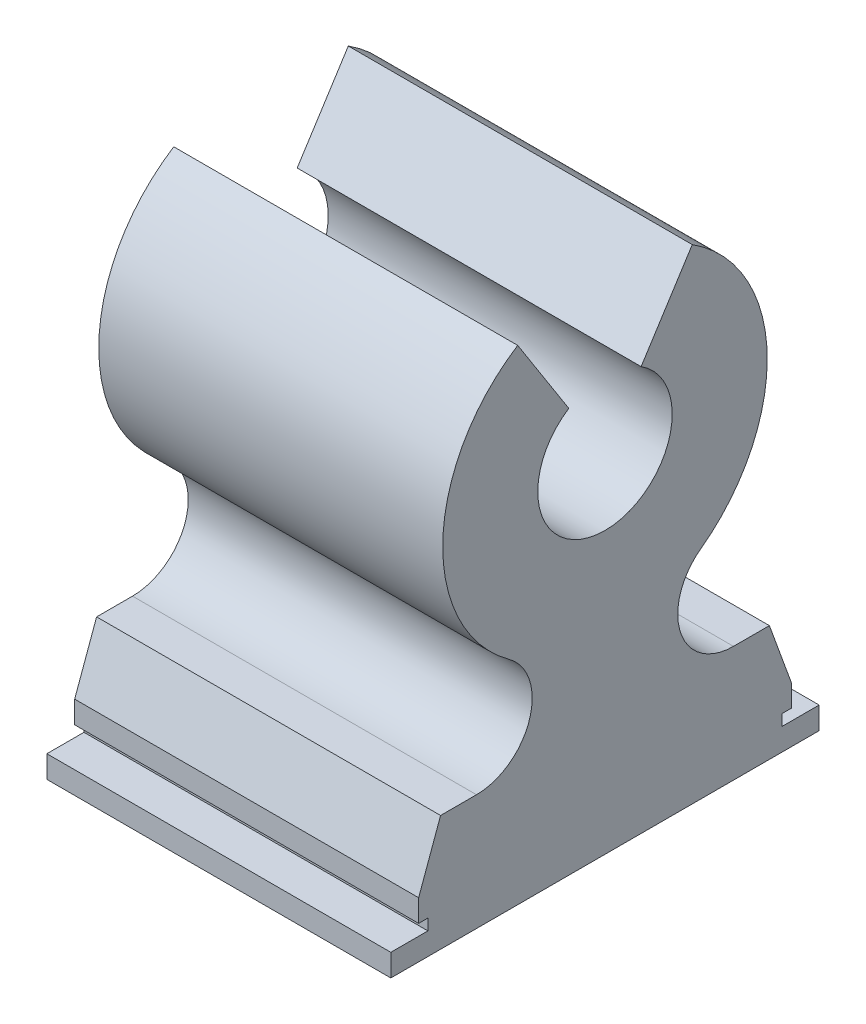
ISO-10303-21;
HEADER;
FILE_DESCRIPTION(('STEP AP214'),'2;1');
FILE_NAME('part.step','',(''),(''),'','','');
FILE_SCHEMA(('AUTOMOTIVE_DESIGN { 1 0 10303 214 1 1 1 1 }'));
ENDSEC;
DATA;
#1=APPLICATION_CONTEXT('core data for automotive mechanical design processes');
#2=APPLICATION_PROTOCOL_DEFINITION('international standard','automotive_design',2000,#1);
#3=PRODUCT_CONTEXT('',#1,'mechanical');
#4=PRODUCT('Part','Part','',(#3));
#5=PRODUCT_RELATED_PRODUCT_CATEGORY('part','',(#4));
#6=PRODUCT_DEFINITION_FORMATION('','',#4);
#7=PRODUCT_DEFINITION_CONTEXT('part definition',#1,'design');
#8=PRODUCT_DEFINITION('design','',#6,#7);
#9=PRODUCT_DEFINITION_SHAPE('','',#8);
#10=(LENGTH_UNIT() NAMED_UNIT(*) SI_UNIT(.MILLI.,.METRE.));
#11=(NAMED_UNIT(*) PLANE_ANGLE_UNIT() SI_UNIT($,.RADIAN.));
#12=(NAMED_UNIT(*) SI_UNIT($,.STERADIAN.) SOLID_ANGLE_UNIT());
#13=UNCERTAINTY_MEASURE_WITH_UNIT(LENGTH_MEASURE(1.E-05),#10,'distance_accuracy_value','');
#14=(GEOMETRIC_REPRESENTATION_CONTEXT(3) GLOBAL_UNCERTAINTY_ASSIGNED_CONTEXT((#13)) GLOBAL_UNIT_ASSIGNED_CONTEXT((#10,
#11,#12)) REPRESENTATION_CONTEXT('',''));
#15=CARTESIAN_POINT('',(0.,0.,0.));
#16=DIRECTION('',(0.,0.,1.));
#17=DIRECTION('',(1.,0.,0.));
#18=AXIS2_PLACEMENT_3D('',#15,#16,#17);
#19=CARTESIAN_POINT('',(9.4234,-9.525,5.8674));
#20=DIRECTION('',(0.,0.,-1.));
#21=DIRECTION('',(0.,1.,0.));
#22=AXIS2_PLACEMENT_3D('',#19,#20,#21);
#23=PLANE('',#22);
#24=DIRECTION('',(0.,-1.,0.));
#25=VECTOR('',#24,1.);
#26=CARTESIAN_POINT('',(0.,-9.525,5.8674));
#27=LINE('',#26,#25);
#28=CARTESIAN_POINT('',(0.,-8.9154,5.8674));
#29=VERTEX_POINT('',#28);
#30=CARTESIAN_POINT('',(0.,-9.525,5.8674));
#31=VERTEX_POINT('',#30);
#32=EDGE_CURVE('E212',#29,#31,#27,.T.);
#33=ORIENTED_EDGE('',*,*,#32,.T.);
#34=DIRECTION('',(-1.,0.,0.));
#35=VECTOR('',#34,1.);
#36=CARTESIAN_POINT('',(9.4234,-9.525,5.8674));
#37=LINE('',#36,#35);
#38=CARTESIAN_POINT('',(9.4234,-9.525,5.8674));
#39=VERTEX_POINT('',#38);
#40=EDGE_CURVE('E11',#39,#31,#37,.T.);
#41=ORIENTED_EDGE('',*,*,#40,.F.);
#42=DIRECTION('',(0.,-1.,0.));
#43=VECTOR('',#42,1.);
#44=CARTESIAN_POINT('',(9.4234,-9.525,5.8674));
#45=LINE('',#44,#43);
#46=CARTESIAN_POINT('',(9.4234,-8.9154,5.8674));
#47=VERTEX_POINT('',#46);
#48=EDGE_CURVE('E254',#47,#39,#45,.T.);
#49=ORIENTED_EDGE('',*,*,#48,.F.);
#50=DIRECTION('',(-1.,0.,0.));
#51=VECTOR('',#50,1.);
#52=CARTESIAN_POINT('',(9.4234,-8.9154,5.8674));
#53=LINE('',#52,#51);
#54=EDGE_CURVE('E208',#47,#29,#53,.T.);
#55=ORIENTED_EDGE('',*,*,#54,.T.);
#56=EDGE_LOOP('',(#33,#41,#49,#55));
#57=FACE_BOUND('',#56,.T.);
#58=ADVANCED_FACE('F32',(#57),#23,.F.);
#59=CARTESIAN_POINT('',(9.4234,-9.525,5.8674));
#60=DIRECTION('',(0.,1.,0.));
#61=DIRECTION('',(0.,0.,1.));
#62=AXIS2_PLACEMENT_3D('',#59,#60,#61);
#63=PLANE('',#62);
#64=DIRECTION('',(0.,0.,-1.));
#65=VECTOR('',#64,1.);
#66=CARTESIAN_POINT('',(0.,-9.525,5.8674));
#67=LINE('',#66,#65);
#68=CARTESIAN_POINT('',(0.,-9.525,-5.8674));
#69=VERTEX_POINT('',#68);
#70=EDGE_CURVE('E215',#31,#69,#67,.T.);
#71=ORIENTED_EDGE('',*,*,#70,.T.);
#72=DIRECTION('',(-1.,0.,0.));
#73=VECTOR('',#72,1.);
#74=CARTESIAN_POINT('',(9.4234,-9.525,-5.8674));
#75=LINE('',#74,#73);
#76=CARTESIAN_POINT('',(9.4234,-9.525,-5.8674));
#77=VERTEX_POINT('',#76);
#78=EDGE_CURVE('E40',#77,#69,#75,.T.);
#79=ORIENTED_EDGE('',*,*,#78,.F.);
#80=DIRECTION('',(0.,0.,-1.));
#81=VECTOR('',#80,1.);
#82=CARTESIAN_POINT('',(9.4234,-9.525,5.8674));
#83=LINE('',#82,#81);
#84=EDGE_CURVE('E133',#39,#77,#83,.T.);
#85=ORIENTED_EDGE('',*,*,#84,.F.);
#86=ORIENTED_EDGE('',*,*,#40,.T.);
#87=EDGE_LOOP('',(#71,#79,#85,#86));
#88=FACE_BOUND('',#87,.T.);
#89=ADVANCED_FACE('F382',(#88),#63,.F.);
#90=CARTESIAN_POINT('',(9.4234,-9.525,-5.8674));
#91=DIRECTION('',(0.,0.,1.));
#92=DIRECTION('',(0.,-1.,0.));
#93=AXIS2_PLACEMENT_3D('',#90,#91,#92);
#94=PLANE('',#93);
#95=DIRECTION('',(0.,1.,0.));
#96=VECTOR('',#95,1.);
#97=CARTESIAN_POINT('',(0.,-9.525,-5.8674));
#98=LINE('',#97,#96);
#99=CARTESIAN_POINT('',(0.,-8.9154,-5.8674));
#100=VERTEX_POINT('',#99);
#101=EDGE_CURVE('E217',#69,#100,#98,.T.);
#102=ORIENTED_EDGE('',*,*,#101,.T.);
#103=DIRECTION('',(-1.,0.,0.));
#104=VECTOR('',#103,1.);
#105=CARTESIAN_POINT('',(9.4234,-8.9154,-5.8674));
#106=LINE('',#105,#104);
#107=CARTESIAN_POINT('',(9.4234,-8.9154,-5.8674));
#108=VERTEX_POINT('',#107);
#109=EDGE_CURVE('E303',#108,#100,#106,.T.);
#110=ORIENTED_EDGE('',*,*,#109,.F.);
#111=DIRECTION('',(0.,1.,0.));
#112=VECTOR('',#111,1.);
#113=CARTESIAN_POINT('',(9.4234,-9.525,-5.8674));
#114=LINE('',#113,#112);
#115=EDGE_CURVE('E311',#77,#108,#114,.T.);
#116=ORIENTED_EDGE('',*,*,#115,.F.);
#117=ORIENTED_EDGE('',*,*,#78,.T.);
#118=EDGE_LOOP('',(#102,#110,#116,#117));
#119=FACE_BOUND('',#118,.T.);
#120=ADVANCED_FACE('F309',(#119),#94,.F.);
#121=CARTESIAN_POINT('',(9.4234,-8.9154,-5.8674));
#122=DIRECTION('',(0.,-1.,0.));
#123=DIRECTION('',(0.,0.,-1.));
#124=AXIS2_PLACEMENT_3D('',#121,#122,#123);
#125=PLANE('',#124);
#126=DIRECTION('',(0.,0.,1.));
#127=VECTOR('',#126,1.);
#128=CARTESIAN_POINT('',(0.,-8.9154,-5.8674));
#129=LINE('',#128,#127);
#130=CARTESIAN_POINT('',(0.,-8.9154,-4.8514));
#131=VERTEX_POINT('',#130);
#132=EDGE_CURVE('E219',#100,#131,#129,.T.);
#133=ORIENTED_EDGE('',*,*,#132,.T.);
#134=DIRECTION('',(-1.,0.,0.));
#135=VECTOR('',#134,1.);
#136=CARTESIAN_POINT('',(9.4234,-8.9154,-4.8514));
#137=LINE('',#136,#135);
#138=CARTESIAN_POINT('',(9.4234,-8.9154,-4.8514));
#139=VERTEX_POINT('',#138);
#140=EDGE_CURVE('E300',#139,#131,#137,.T.);
#141=ORIENTED_EDGE('',*,*,#140,.F.);
#142=DIRECTION('',(0.,0.,1.));
#143=VECTOR('',#142,1.);
#144=CARTESIAN_POINT('',(9.4234,-8.9154,-5.8674));
#145=LINE('',#144,#143);
#146=EDGE_CURVE('E329',#108,#139,#145,.T.);
#147=ORIENTED_EDGE('',*,*,#146,.F.);
#148=ORIENTED_EDGE('',*,*,#109,.T.);
#149=EDGE_LOOP('',(#133,#141,#147,#148));
#150=FACE_BOUND('',#149,.T.);
#151=ADVANCED_FACE('F320',(#150),#125,.F.);
#152=CARTESIAN_POINT('',(9.4234,-8.9154,-4.8514));
#153=DIRECTION('',(0.,0.,1.));
#154=DIRECTION('',(0.,-1.,0.));
#155=AXIS2_PLACEMENT_3D('',#152,#153,#154);
#156=PLANE('',#155);
#157=DIRECTION('',(0.,1.,0.));
#158=VECTOR('',#157,1.);
#159=CARTESIAN_POINT('',(0.,-8.9154,-4.8514));
#160=LINE('',#159,#158);
#161=CARTESIAN_POINT('',(0.,-8.6106,-4.8514));
#162=VERTEX_POINT('',#161);
#163=EDGE_CURVE('E221',#131,#162,#160,.T.);
#164=ORIENTED_EDGE('',*,*,#163,.T.);
#165=DIRECTION('',(-1.,0.,0.));
#166=VECTOR('',#165,1.);
#167=CARTESIAN_POINT('',(9.4234,-8.6106,-4.8514));
#168=LINE('',#167,#166);
#169=CARTESIAN_POINT('',(9.4234,-8.6106,-4.8514));
#170=VERTEX_POINT('',#169);
#171=EDGE_CURVE('E297',#170,#162,#168,.T.);
#172=ORIENTED_EDGE('',*,*,#171,.F.);
#173=DIRECTION('',(0.,1.,0.));
#174=VECTOR('',#173,1.);
#175=CARTESIAN_POINT('',(9.4234,-8.9154,-4.8514));
#176=LINE('',#175,#174);
#177=EDGE_CURVE('E326',#139,#170,#176,.T.);
#178=ORIENTED_EDGE('',*,*,#177,.F.);
#179=ORIENTED_EDGE('',*,*,#140,.T.);
#180=EDGE_LOOP('',(#164,#172,#178,#179));
#181=FACE_BOUND('',#180,.T.);
#182=ADVANCED_FACE('F324',(#181),#156,.F.);
#183=CARTESIAN_POINT('',(9.4234,-8.6106,-4.8514));
#184=DIRECTION('',(0.,1.,0.));
#185=DIRECTION('',(0.,0.,1.));
#186=AXIS2_PLACEMENT_3D('',#183,#184,#185);
#187=PLANE('',#186);
#188=DIRECTION('',(0.,0.,-1.));
#189=VECTOR('',#188,1.);
#190=CARTESIAN_POINT('',(0.,-8.6106,-4.8514));
#191=LINE('',#190,#189);
#192=CARTESIAN_POINT('',(0.,-8.6106,-5.1054));
#193=VERTEX_POINT('',#192);
#194=EDGE_CURVE('E223',#162,#193,#191,.T.);
#195=ORIENTED_EDGE('',*,*,#194,.T.);
#196=DIRECTION('',(-1.,0.,0.));
#197=VECTOR('',#196,1.);
#198=CARTESIAN_POINT('',(9.4234,-8.6106,-5.1054));
#199=LINE('',#198,#197);
#200=CARTESIAN_POINT('',(9.4234,-8.6106,-5.1054));
#201=VERTEX_POINT('',#200);
#202=EDGE_CURVE('E294',#201,#193,#199,.T.);
#203=ORIENTED_EDGE('',*,*,#202,.F.);
#204=DIRECTION('',(0.,0.,-1.));
#205=VECTOR('',#204,1.);
#206=CARTESIAN_POINT('',(9.4234,-8.6106,-4.8514));
#207=LINE('',#206,#205);
#208=EDGE_CURVE('E328',#170,#201,#207,.T.);
#209=ORIENTED_EDGE('',*,*,#208,.F.);
#210=ORIENTED_EDGE('',*,*,#171,.T.);
#211=EDGE_LOOP('',(#195,#203,#209,#210));
#212=FACE_BOUND('',#211,.T.);
#213=ADVANCED_FACE('F395',(#212),#187,.F.);
#214=CARTESIAN_POINT('',(9.4234,-8.001,-5.1054));
#215=DIRECTION('',(0.,0.,1.));
#216=DIRECTION('',(0.,-1.,0.));
#217=AXIS2_PLACEMENT_3D('',#214,#215,#216);
#218=PLANE('',#217);
#219=DIRECTION('',(0.,1.,0.));
#220=VECTOR('',#219,1.);
#221=CARTESIAN_POINT('',(0.,-8.001,-5.1054));
#222=LINE('',#221,#220);
#223=CARTESIAN_POINT('',(0.,-8.001,-5.1054));
#224=VERTEX_POINT('',#223);
#225=EDGE_CURVE('E225',#193,#224,#222,.T.);
#226=ORIENTED_EDGE('',*,*,#225,.T.);
#227=DIRECTION('',(-1.,0.,0.));
#228=VECTOR('',#227,1.);
#229=CARTESIAN_POINT('',(9.4234,-8.001,-5.1054));
#230=LINE('',#229,#228);
#231=CARTESIAN_POINT('',(9.4234,-8.001,-5.1054));
#232=VERTEX_POINT('',#231);
#233=EDGE_CURVE('E291',#232,#224,#230,.T.);
#234=ORIENTED_EDGE('',*,*,#233,.F.);
#235=DIRECTION('',(0.,1.,0.));
#236=VECTOR('',#235,1.);
#237=CARTESIAN_POINT('',(9.4234,-8.001,-5.1054));
#238=LINE('',#237,#236);
#239=EDGE_CURVE('E331',#201,#232,#238,.T.);
#240=ORIENTED_EDGE('',*,*,#239,.F.);
#241=ORIENTED_EDGE('',*,*,#202,.T.);
#242=EDGE_LOOP('',(#226,#234,#240,#241));
#243=FACE_BOUND('',#242,.T.);
#244=ADVANCED_FACE('F398',(#243),#218,.F.);
#245=CARTESIAN_POINT('',(9.4234,-6.35,-4.5044851432265));
#246=DIRECTION('',(0.,-0.34202014332567,0.939692620785908));
#247=DIRECTION('',(0.,-0.939692620785908,-0.34202014332567));
#248=AXIS2_PLACEMENT_3D('',#245,#246,#247);
#249=PLANE('',#248);
#250=DIRECTION('',(0.,0.939692620785908,0.34202014332567));
#251=VECTOR('',#250,1.);
#252=CARTESIAN_POINT('',(0.,-6.35,-4.5044851432265));
#253=LINE('',#252,#251);
#254=CARTESIAN_POINT('',(0.,-6.35,-4.5044851432265));
#255=VERTEX_POINT('',#254);
#256=EDGE_CURVE('E227',#224,#255,#253,.T.);
#257=ORIENTED_EDGE('',*,*,#256,.T.);
#258=DIRECTION('',(-1.,0.,0.));
#259=VECTOR('',#258,1.);
#260=CARTESIAN_POINT('',(9.4234,-6.35,-4.5044851432265));
#261=LINE('',#260,#259);
#262=CARTESIAN_POINT('',(9.4234,-6.35,-4.5044851432265));
#263=VERTEX_POINT('',#262);
#264=EDGE_CURVE('E288',#263,#255,#261,.T.);
#265=ORIENTED_EDGE('',*,*,#264,.F.);
#266=DIRECTION('',(0.,0.939692620785908,0.34202014332567));
#267=VECTOR('',#266,1.);
#268=CARTESIAN_POINT('',(9.4234,-6.35,-4.5044851432265));
#269=LINE('',#268,#267);
#270=EDGE_CURVE('E337',#232,#263,#269,.T.);
#271=ORIENTED_EDGE('',*,*,#270,.F.);
#272=ORIENTED_EDGE('',*,*,#233,.T.);
#273=EDGE_LOOP('',(#257,#265,#271,#272));
#274=FACE_BOUND('',#273,.T.);
#275=ADVANCED_FACE('F402',(#274),#249,.F.);
#276=CARTESIAN_POINT('',(9.4234,-6.35,-4.5044851432265));
#277=DIRECTION('',(0.,-1.,0.));
#278=DIRECTION('',(0.,0.,-1.));
#279=AXIS2_PLACEMENT_3D('',#276,#277,#278);
#280=PLANE('',#279);
#281=DIRECTION('',(0.,0.,1.));
#282=VECTOR('',#281,1.);
#283=CARTESIAN_POINT('',(0.,-6.35,-4.5044851432265));
#284=LINE('',#283,#282);
#285=CARTESIAN_POINT('',(0.,-6.35,-3.5204382262572));
#286=VERTEX_POINT('',#285);
#287=EDGE_CURVE('E229',#255,#286,#284,.T.);
#288=ORIENTED_EDGE('',*,*,#287,.T.);
#289=DIRECTION('',(-1.,0.,0.));
#290=VECTOR('',#289,1.);
#291=CARTESIAN_POINT('',(9.4234,-6.35,-3.5204382262572));
#292=LINE('',#291,#290);
#293=CARTESIAN_POINT('',(9.4234,-6.35,-3.5204382262572));
#294=VERTEX_POINT('',#293);
#295=EDGE_CURVE('E285',#294,#286,#292,.T.);
#296=ORIENTED_EDGE('',*,*,#295,.F.);
#297=DIRECTION('',(0.,0.,1.));
#298=VECTOR('',#297,1.);
#299=CARTESIAN_POINT('',(9.4234,-6.35,-4.5044851432265));
#300=LINE('',#299,#298);
#301=EDGE_CURVE('E339',#263,#294,#300,.T.);
#302=ORIENTED_EDGE('',*,*,#301,.F.);
#303=ORIENTED_EDGE('',*,*,#264,.T.);
#304=EDGE_LOOP('',(#288,#296,#302,#303));
#305=FACE_BOUND('',#304,.T.);
#306=ADVANCED_FACE('F406',(#305),#280,.F.);
#307=CARTESIAN_POINT('',(9.4234,-4.8234617737428,-3.5204382262572));
#308=DIRECTION('',(-1.,0.,0.));
#309=DIRECTION('',(0.,0.,1.));
#310=AXIS2_PLACEMENT_3D('',#307,#308,#309);
#311=CYLINDRICAL_SURFACE('',#310,1.5265382262572);
#312=CARTESIAN_POINT('',(0.,-4.8234617737428,-3.5204382262572));
#313=DIRECTION('',(-1.,0.,0.));
#314=DIRECTION('',(0.,0.,1.));
#315=AXIS2_PLACEMENT_3D('',#312,#313,#314);
#316=CIRCLE('',#315,1.5265382262572);
#317=CARTESIAN_POINT('',(0.,-3.59041285041307,-2.62048861161209));
#318=VERTEX_POINT('',#317);
#319=EDGE_CURVE('E231',#286,#318,#316,.T.);
#320=ORIENTED_EDGE('',*,*,#319,.T.);
#321=DIRECTION('',(-1.,0.,0.));
#322=VECTOR('',#321,1.);
#323=CARTESIAN_POINT('',(9.4234,-3.59041285041307,-2.62048861161209));
#324=LINE('',#323,#322);
#325=CARTESIAN_POINT('',(9.4234,-3.59041285041307,-2.62048861161209));
#326=VERTEX_POINT('',#325);
#327=EDGE_CURVE('E282',#326,#318,#324,.T.);
#328=ORIENTED_EDGE('',*,*,#327,.F.);
#329=CARTESIAN_POINT('',(9.4234,-4.8234617737428,-3.5204382262572));
#330=DIRECTION('',(-1.,0.,0.));
#331=DIRECTION('',(0.,0.,1.));
#332=AXIS2_PLACEMENT_3D('',#329,#330,#331);
#333=CIRCLE('',#332,1.5265382262572);
#334=EDGE_CURVE('E341',#294,#326,#333,.T.);
#335=ORIENTED_EDGE('',*,*,#334,.F.);
#336=ORIENTED_EDGE('',*,*,#295,.T.);
#337=EDGE_LOOP('',(#320,#328,#335,#336));
#338=FACE_BOUND('',#337,.T.);
#339=ADVANCED_FACE('F410',(#338),#311,.F.);
#340=CARTESIAN_POINT('',(9.4234,0.,0.));
#341=DIRECTION('',(-1.,0.,0.));
#342=DIRECTION('',(0.,0.,1.));
#343=AXIS2_PLACEMENT_3D('',#340,#341,#342);
#344=CYLINDRICAL_SURFACE('',#343,4.445);
#345=CARTESIAN_POINT('',(0.,0.,0.));
#346=DIRECTION('',(1.,0.,0.));
#347=DIRECTION('',(0.,0.,-1.));
#348=AXIS2_PLACEMENT_3D('',#345,#346,#347);
#349=CIRCLE('',#348,4.445);
#350=CARTESIAN_POINT('',(0.,3.74708544066496,-2.39110344827586));
#351=VERTEX_POINT('',#350);
#352=EDGE_CURVE('E233',#318,#351,#349,.T.);
#353=ORIENTED_EDGE('',*,*,#352,.T.);
#354=DIRECTION('',(-1.,0.,0.));
#355=VECTOR('',#354,1.);
#356=CARTESIAN_POINT('',(9.4234,3.74708544066496,-2.39110344827586));
#357=LINE('',#356,#355);
#358=CARTESIAN_POINT('',(9.4234,3.74708544066496,-2.39110344827586));
#359=VERTEX_POINT('',#358);
#360=EDGE_CURVE('E279',#359,#351,#357,.T.);
#361=ORIENTED_EDGE('',*,*,#360,.F.);
#362=CARTESIAN_POINT('',(9.4234,0.,0.));
#363=DIRECTION('',(1.,0.,0.));
#364=DIRECTION('',(0.,0.,-1.));
#365=AXIS2_PLACEMENT_3D('',#362,#363,#364);
#366=CIRCLE('',#365,4.445);
#367=EDGE_CURVE('E343',#326,#359,#366,.T.);
#368=ORIENTED_EDGE('',*,*,#367,.F.);
#369=ORIENTED_EDGE('',*,*,#327,.T.);
#370=EDGE_LOOP('',(#353,#361,#368,#369));
#371=FACE_BOUND('',#370,.T.);
#372=ADVANCED_FACE('F414',(#371),#344,.T.);
#373=CARTESIAN_POINT('',(9.4234,1.55236396827548,-0.9906));
#374=DIRECTION('',(0.,-0.537931034482758,-0.842988850543297));
#375=DIRECTION('',(0.,0.842988850543297,-0.537931034482758));
#376=AXIS2_PLACEMENT_3D('',#373,#374,#375);
#377=PLANE('',#376);
#378=DIRECTION('',(0.,-0.842988850543297,0.537931034482758));
#379=VECTOR('',#378,1.);
#380=CARTESIAN_POINT('',(0.,1.55236396827548,-0.9906));
#381=LINE('',#380,#379);
#382=CARTESIAN_POINT('',(0.,1.55236396827548,-0.9906));
#383=VERTEX_POINT('',#382);
#384=EDGE_CURVE('E235',#351,#383,#381,.T.);
#385=ORIENTED_EDGE('',*,*,#384,.T.);
#386=DIRECTION('',(-1.,0.,0.));
#387=VECTOR('',#386,1.);
#388=CARTESIAN_POINT('',(9.4234,1.55236396827548,-0.9906));
#389=LINE('',#388,#387);
#390=CARTESIAN_POINT('',(9.4234,1.55236396827548,-0.9906));
#391=VERTEX_POINT('',#390);
#392=EDGE_CURVE('E276',#391,#383,#389,.T.);
#393=ORIENTED_EDGE('',*,*,#392,.F.);
#394=DIRECTION('',(0.,-0.842988850543297,0.537931034482758));
#395=VECTOR('',#394,1.);
#396=CARTESIAN_POINT('',(9.4234,1.55236396827548,-0.9906));
#397=LINE('',#396,#395);
#398=EDGE_CURVE('E345',#359,#391,#397,.T.);
#399=ORIENTED_EDGE('',*,*,#398,.F.);
#400=ORIENTED_EDGE('',*,*,#360,.T.);
#401=EDGE_LOOP('',(#385,#393,#399,#400));
#402=FACE_BOUND('',#401,.T.);
#403=ADVANCED_FACE('F418',(#402),#377,.F.);
#404=CARTESIAN_POINT('',(9.4234,0.,0.));
#405=DIRECTION('',(-1.,0.,0.));
#406=DIRECTION('',(0.,0.,1.));
#407=AXIS2_PLACEMENT_3D('',#404,#405,#406);
#408=CYLINDRICAL_SURFACE('',#407,1.8415);
#409=CARTESIAN_POINT('',(0.,0.,0.));
#410=DIRECTION('',(-1.,0.,0.));
#411=DIRECTION('',(0.,0.,-1.));
#412=AXIS2_PLACEMENT_3D('',#409,#410,#411);
#413=CIRCLE('',#412,1.8415);
#414=CARTESIAN_POINT('',(0.,1.55236396827548,0.990599999999999));
#415=VERTEX_POINT('',#414);
#416=EDGE_CURVE('E237',#383,#415,#413,.T.);
#417=ORIENTED_EDGE('',*,*,#416,.T.);
#418=DIRECTION('',(-1.,0.,0.));
#419=VECTOR('',#418,1.);
#420=CARTESIAN_POINT('',(9.4234,1.55236396827548,0.990599999999999));
#421=LINE('',#420,#419);
#422=CARTESIAN_POINT('',(9.4234,1.55236396827548,0.990599999999999));
#423=VERTEX_POINT('',#422);
#424=EDGE_CURVE('E273',#423,#415,#421,.T.);
#425=ORIENTED_EDGE('',*,*,#424,.F.);
#426=CARTESIAN_POINT('',(9.4234,0.,0.));
#427=DIRECTION('',(-1.,0.,0.));
#428=DIRECTION('',(0.,0.,-1.));
#429=AXIS2_PLACEMENT_3D('',#426,#427,#428);
#430=CIRCLE('',#429,1.8415);
#431=EDGE_CURVE('E347',#391,#423,#430,.T.);
#432=ORIENTED_EDGE('',*,*,#431,.F.);
#433=ORIENTED_EDGE('',*,*,#392,.T.);
#434=EDGE_LOOP('',(#417,#425,#432,#433));
#435=FACE_BOUND('',#434,.T.);
#436=ADVANCED_FACE('F422',(#435),#408,.F.);
#437=CARTESIAN_POINT('',(9.4234,1.55236396827548,0.9906));
#438=DIRECTION('',(0.,-0.537931034482758,0.842988850543297));
#439=DIRECTION('',(0.,-0.842988850543297,-0.537931034482758));
#440=AXIS2_PLACEMENT_3D('',#437,#438,#439);
#441=PLANE('',#440);
#442=DIRECTION('',(0.,0.842988850543297,0.537931034482758));
#443=VECTOR('',#442,1.);
#444=CARTESIAN_POINT('',(0.,1.55236396827548,0.9906));
#445=LINE('',#444,#443);
#446=CARTESIAN_POINT('',(0.,3.74708544066496,2.39110344827586));
#447=VERTEX_POINT('',#446);
#448=EDGE_CURVE('E239',#415,#447,#445,.T.);
#449=ORIENTED_EDGE('',*,*,#448,.T.);
#450=DIRECTION('',(-1.,0.,0.));
#451=VECTOR('',#450,1.);
#452=CARTESIAN_POINT('',(9.4234,3.74708544066496,2.39110344827586));
#453=LINE('',#452,#451);
#454=CARTESIAN_POINT('',(9.4234,3.74708544066496,2.39110344827586));
#455=VERTEX_POINT('',#454);
#456=EDGE_CURVE('E270',#455,#447,#453,.T.);
#457=ORIENTED_EDGE('',*,*,#456,.F.);
#458=DIRECTION('',(0.,0.842988850543297,0.537931034482758));
#459=VECTOR('',#458,1.);
#460=CARTESIAN_POINT('',(9.4234,1.55236396827548,0.9906));
#461=LINE('',#460,#459);
#462=EDGE_CURVE('E349',#423,#455,#461,.T.);
#463=ORIENTED_EDGE('',*,*,#462,.F.);
#464=ORIENTED_EDGE('',*,*,#424,.T.);
#465=EDGE_LOOP('',(#449,#457,#463,#464));
#466=FACE_BOUND('',#465,.T.);
#467=ADVANCED_FACE('F426',(#466),#441,.F.);
#468=CARTESIAN_POINT('',(9.4234,0.,0.));
#469=DIRECTION('',(-1.,0.,0.));
#470=DIRECTION('',(0.,0.,1.));
#471=AXIS2_PLACEMENT_3D('',#468,#469,#470);
#472=CYLINDRICAL_SURFACE('',#471,4.445);
#473=CARTESIAN_POINT('',(0.,0.,0.));
#474=DIRECTION('',(1.,0.,0.));
#475=DIRECTION('',(0.,0.,-1.));
#476=AXIS2_PLACEMENT_3D('',#473,#474,#475);
#477=CIRCLE('',#476,4.445);
#478=CARTESIAN_POINT('',(0.,-3.59041285041307,2.62048861161209));
#479=VERTEX_POINT('',#478);
#480=EDGE_CURVE('E241',#447,#479,#477,.T.);
#481=ORIENTED_EDGE('',*,*,#480,.T.);
#482=DIRECTION('',(-1.,0.,0.));
#483=VECTOR('',#482,1.);
#484=CARTESIAN_POINT('',(9.4234,-3.59041285041307,2.62048861161209));
#485=LINE('',#484,#483);
#486=CARTESIAN_POINT('',(9.4234,-3.59041285041307,2.62048861161209));
#487=VERTEX_POINT('',#486);
#488=EDGE_CURVE('E267',#487,#479,#485,.T.);
#489=ORIENTED_EDGE('',*,*,#488,.F.);
#490=CARTESIAN_POINT('',(9.4234,0.,0.));
#491=DIRECTION('',(1.,0.,0.));
#492=DIRECTION('',(0.,0.,-1.));
#493=AXIS2_PLACEMENT_3D('',#490,#491,#492);
#494=CIRCLE('',#493,4.445);
#495=EDGE_CURVE('E351',#455,#487,#494,.T.);
#496=ORIENTED_EDGE('',*,*,#495,.F.);
#497=ORIENTED_EDGE('',*,*,#456,.T.);
#498=EDGE_LOOP('',(#481,#489,#496,#497));
#499=FACE_BOUND('',#498,.T.);
#500=ADVANCED_FACE('F430',(#499),#472,.T.);
#501=CARTESIAN_POINT('',(9.4234,-4.8234617737428,3.5204382262572));
#502=DIRECTION('',(-1.,0.,0.));
#503=DIRECTION('',(0.,0.,1.));
#504=AXIS2_PLACEMENT_3D('',#501,#502,#503);
#505=CYLINDRICAL_SURFACE('',#504,1.5265382262572);
#506=CARTESIAN_POINT('',(0.,-4.8234617737428,3.5204382262572));
#507=DIRECTION('',(-1.,0.,0.));
#508=DIRECTION('',(0.,0.,1.));
#509=AXIS2_PLACEMENT_3D('',#506,#507,#508);
#510=CIRCLE('',#509,1.5265382262572);
#511=CARTESIAN_POINT('',(0.,-6.35,3.5204382262572));
#512=VERTEX_POINT('',#511);
#513=EDGE_CURVE('E243',#479,#512,#510,.T.);
#514=ORIENTED_EDGE('',*,*,#513,.T.);
#515=DIRECTION('',(-1.,0.,0.));
#516=VECTOR('',#515,1.);
#517=CARTESIAN_POINT('',(9.4234,-6.35,3.5204382262572));
#518=LINE('',#517,#516);
#519=CARTESIAN_POINT('',(9.4234,-6.35,3.5204382262572));
#520=VERTEX_POINT('',#519);
#521=EDGE_CURVE('E264',#520,#512,#518,.T.);
#522=ORIENTED_EDGE('',*,*,#521,.F.);
#523=CARTESIAN_POINT('',(9.4234,-4.8234617737428,3.5204382262572));
#524=DIRECTION('',(-1.,0.,0.));
#525=DIRECTION('',(0.,0.,1.));
#526=AXIS2_PLACEMENT_3D('',#523,#524,#525);
#527=CIRCLE('',#526,1.5265382262572);
#528=EDGE_CURVE('E353',#487,#520,#527,.T.);
#529=ORIENTED_EDGE('',*,*,#528,.F.);
#530=ORIENTED_EDGE('',*,*,#488,.T.);
#531=EDGE_LOOP('',(#514,#522,#529,#530));
#532=FACE_BOUND('',#531,.T.);
#533=ADVANCED_FACE('F434',(#532),#505,.F.);
#534=CARTESIAN_POINT('',(9.4234,-6.35,3.5204382262572));
#535=DIRECTION('',(0.,-1.,0.));
#536=DIRECTION('',(0.,0.,-1.));
#537=AXIS2_PLACEMENT_3D('',#534,#535,#536);
#538=PLANE('',#537);
#539=DIRECTION('',(0.,0.,1.));
#540=VECTOR('',#539,1.);
#541=CARTESIAN_POINT('',(0.,-6.35,3.5204382262572));
#542=LINE('',#541,#540);
#543=CARTESIAN_POINT('',(0.,-6.35,4.5044851432265));
#544=VERTEX_POINT('',#543);
#545=EDGE_CURVE('E245',#512,#544,#542,.T.);
#546=ORIENTED_EDGE('',*,*,#545,.T.);
#547=DIRECTION('',(-1.,0.,0.));
#548=VECTOR('',#547,1.);
#549=CARTESIAN_POINT('',(9.4234,-6.35,4.5044851432265));
#550=LINE('',#549,#548);
#551=CARTESIAN_POINT('',(9.4234,-6.35,4.5044851432265));
#552=VERTEX_POINT('',#551);
#553=EDGE_CURVE('E261',#552,#544,#550,.T.);
#554=ORIENTED_EDGE('',*,*,#553,.F.);
#555=DIRECTION('',(0.,0.,1.));
#556=VECTOR('',#555,1.);
#557=CARTESIAN_POINT('',(9.4234,-6.35,3.5204382262572));
#558=LINE('',#557,#556);
#559=EDGE_CURVE('E355',#520,#552,#558,.T.);
#560=ORIENTED_EDGE('',*,*,#559,.F.);
#561=ORIENTED_EDGE('',*,*,#521,.T.);
#562=EDGE_LOOP('',(#546,#554,#560,#561));
#563=FACE_BOUND('',#562,.T.);
#564=ADVANCED_FACE('F438',(#563),#538,.F.);
#565=CARTESIAN_POINT('',(9.4234,-6.35,4.5044851432265));
#566=DIRECTION('',(0.,-0.34202014332567,-0.939692620785908));
#567=DIRECTION('',(0.,0.939692620785908,-0.34202014332567));
#568=AXIS2_PLACEMENT_3D('',#565,#566,#567);
#569=PLANE('',#568);
#570=DIRECTION('',(0.,-0.939692620785908,0.34202014332567));
#571=VECTOR('',#570,1.);
#572=CARTESIAN_POINT('',(0.,-6.35,4.5044851432265));
#573=LINE('',#572,#571);
#574=CARTESIAN_POINT('',(0.,-8.001,5.1054));
#575=VERTEX_POINT('',#574);
#576=EDGE_CURVE('E247',#544,#575,#573,.T.);
#577=ORIENTED_EDGE('',*,*,#576,.T.);
#578=DIRECTION('',(-1.,0.,0.));
#579=VECTOR('',#578,1.);
#580=CARTESIAN_POINT('',(9.4234,-8.001,5.1054));
#581=LINE('',#580,#579);
#582=CARTESIAN_POINT('',(9.4234,-8.001,5.1054));
#583=VERTEX_POINT('',#582);
#584=EDGE_CURVE('E258',#583,#575,#581,.T.);
#585=ORIENTED_EDGE('',*,*,#584,.F.);
#586=DIRECTION('',(0.,-0.939692620785908,0.34202014332567));
#587=VECTOR('',#586,1.);
#588=CARTESIAN_POINT('',(9.4234,-6.35,4.5044851432265));
#589=LINE('',#588,#587);
#590=EDGE_CURVE('E357',#552,#583,#589,.T.);
#591=ORIENTED_EDGE('',*,*,#590,.F.);
#592=ORIENTED_EDGE('',*,*,#553,.T.);
#593=EDGE_LOOP('',(#577,#585,#591,#592));
#594=FACE_BOUND('',#593,.T.);
#595=ADVANCED_FACE('F363',(#594),#569,.F.);
#596=CARTESIAN_POINT('',(9.4234,-8.001,5.1054));
#597=DIRECTION('',(0.,0.,-1.));
#598=DIRECTION('',(0.,1.,0.));
#599=AXIS2_PLACEMENT_3D('',#596,#597,#598);
#600=PLANE('',#599);
#601=DIRECTION('',(0.,-1.,0.));
#602=VECTOR('',#601,1.);
#603=CARTESIAN_POINT('',(0.,-8.001,5.1054));
#604=LINE('',#603,#602);
#605=CARTESIAN_POINT('',(0.,-8.6106,5.1054));
#606=VERTEX_POINT('',#605);
#607=EDGE_CURVE('E249',#575,#606,#604,.T.);
#608=ORIENTED_EDGE('',*,*,#607,.T.);
#609=DIRECTION('',(-1.,0.,0.));
#610=VECTOR('',#609,1.);
#611=CARTESIAN_POINT('',(9.4234,-8.6106,5.1054));
#612=LINE('',#611,#610);
#613=CARTESIAN_POINT('',(9.4234,-8.6106,5.1054));
#614=VERTEX_POINT('',#613);
#615=EDGE_CURVE('E203',#614,#606,#612,.T.);
#616=ORIENTED_EDGE('',*,*,#615,.F.);
#617=DIRECTION('',(0.,-1.,0.));
#618=VECTOR('',#617,1.);
#619=CARTESIAN_POINT('',(9.4234,-8.001,5.1054));
#620=LINE('',#619,#618);
#621=EDGE_CURVE('E194',#583,#614,#620,.T.);
#622=ORIENTED_EDGE('',*,*,#621,.F.);
#623=ORIENTED_EDGE('',*,*,#584,.T.);
#624=EDGE_LOOP('',(#608,#616,#622,#623));
#625=FACE_BOUND('',#624,.T.);
#626=ADVANCED_FACE('F367',(#625),#600,.F.);
#627=CARTESIAN_POINT('',(9.4234,-8.6106,4.8514));
#628=DIRECTION('',(0.,1.,0.));
#629=DIRECTION('',(0.,0.,1.));
#630=AXIS2_PLACEMENT_3D('',#627,#628,#629);
#631=PLANE('',#630);
#632=DIRECTION('',(0.,0.,-1.));
#633=VECTOR('',#632,1.);
#634=CARTESIAN_POINT('',(0.,-8.6106,4.8514));
#635=LINE('',#634,#633);
#636=CARTESIAN_POINT('',(0.,-8.6106,4.8514));
#637=VERTEX_POINT('',#636);
#638=EDGE_CURVE('E202',#606,#637,#635,.T.);
#639=ORIENTED_EDGE('',*,*,#638,.T.);
#640=DIRECTION('',(-1.,0.,0.));
#641=VECTOR('',#640,1.);
#642=CARTESIAN_POINT('',(9.4234,-8.6106,4.8514));
#643=LINE('',#642,#641);
#644=CARTESIAN_POINT('',(9.4234,-8.6106,4.8514));
#645=VERTEX_POINT('',#644);
#646=EDGE_CURVE('E199',#645,#637,#643,.T.);
#647=ORIENTED_EDGE('',*,*,#646,.F.);
#648=DIRECTION('',(0.,0.,-1.));
#649=VECTOR('',#648,1.);
#650=CARTESIAN_POINT('',(9.4234,-8.6106,4.8514));
#651=LINE('',#650,#649);
#652=EDGE_CURVE('E188',#614,#645,#651,.T.);
#653=ORIENTED_EDGE('',*,*,#652,.F.);
#654=ORIENTED_EDGE('',*,*,#615,.T.);
#655=EDGE_LOOP('',(#639,#647,#653,#654));
#656=FACE_BOUND('',#655,.T.);
#657=ADVANCED_FACE('F200',(#656),#631,.F.);
#658=CARTESIAN_POINT('',(9.4234,-8.9154,4.8514));
#659=DIRECTION('',(0.,0.,-1.));
#660=DIRECTION('',(0.,1.,0.));
#661=AXIS2_PLACEMENT_3D('',#658,#659,#660);
#662=PLANE('',#661);
#663=DIRECTION('',(0.,-1.,0.));
#664=VECTOR('',#663,1.);
#665=CARTESIAN_POINT('',(0.,-8.9154,4.8514));
#666=LINE('',#665,#664);
#667=CARTESIAN_POINT('',(0.,-8.9154,4.8514));
#668=VERTEX_POINT('',#667);
#669=EDGE_CURVE('E119',#637,#668,#666,.T.);
#670=ORIENTED_EDGE('',*,*,#669,.T.);
#671=DIRECTION('',(-1.,0.,0.));
#672=VECTOR('',#671,1.);
#673=CARTESIAN_POINT('',(9.4234,-8.9154,4.8514));
#674=LINE('',#673,#672);
#675=CARTESIAN_POINT('',(9.4234,-8.9154,4.8514));
#676=VERTEX_POINT('',#675);
#677=EDGE_CURVE('E204',#676,#668,#674,.T.);
#678=ORIENTED_EDGE('',*,*,#677,.F.);
#679=DIRECTION('',(0.,-1.,0.));
#680=VECTOR('',#679,1.);
#681=CARTESIAN_POINT('',(9.4234,-8.9154,4.8514));
#682=LINE('',#681,#680);
#683=EDGE_CURVE('E192',#645,#676,#682,.T.);
#684=ORIENTED_EDGE('',*,*,#683,.F.);
#685=ORIENTED_EDGE('',*,*,#646,.T.);
#686=EDGE_LOOP('',(#670,#678,#684,#685));
#687=FACE_BOUND('',#686,.T.);
#688=ADVANCED_FACE('F206',(#687),#662,.F.);
#689=CARTESIAN_POINT('',(9.4234,-8.9154,5.8674));
#690=DIRECTION('',(0.,-1.,0.));
#691=DIRECTION('',(0.,0.,-1.));
#692=AXIS2_PLACEMENT_3D('',#689,#690,#691);
#693=PLANE('',#692);
#694=DIRECTION('',(0.,0.,1.));
#695=VECTOR('',#694,1.);
#696=CARTESIAN_POINT('',(0.,-8.9154,5.8674));
#697=LINE('',#696,#695);
#698=EDGE_CURVE('E125',#668,#29,#697,.T.);
#699=ORIENTED_EDGE('',*,*,#698,.T.);
#700=ORIENTED_EDGE('',*,*,#54,.F.);
#701=DIRECTION('',(0.,0.,1.));
#702=VECTOR('',#701,1.);
#703=CARTESIAN_POINT('',(9.4234,-8.9154,5.8674));
#704=LINE('',#703,#702);
#705=EDGE_CURVE('E48',#676,#47,#704,.T.);
#706=ORIENTED_EDGE('',*,*,#705,.F.);
#707=ORIENTED_EDGE('',*,*,#677,.T.);
#708=EDGE_LOOP('',(#699,#700,#706,#707));
#709=FACE_BOUND('',#708,.T.);
#710=ADVANCED_FACE('F371',(#709),#693,.F.);
#711=CARTESIAN_POINT('',(9.4234,-4.8234617737428,3.5204382262572));
#712=DIRECTION('',(-1.,0.,0.));
#713=DIRECTION('',(0.,0.,1.));
#714=AXIS2_PLACEMENT_3D('',#711,#712,#713);
#715=PLANE('',#714);
#716=ORIENTED_EDGE('',*,*,#48,.T.);
#717=ORIENTED_EDGE('',*,*,#84,.T.);
#718=ORIENTED_EDGE('',*,*,#115,.T.);
#719=ORIENTED_EDGE('',*,*,#146,.T.);
#720=ORIENTED_EDGE('',*,*,#177,.T.);
#721=ORIENTED_EDGE('',*,*,#208,.T.);
#722=ORIENTED_EDGE('',*,*,#239,.T.);
#723=ORIENTED_EDGE('',*,*,#270,.T.);
#724=ORIENTED_EDGE('',*,*,#301,.T.);
#725=ORIENTED_EDGE('',*,*,#334,.T.);
#726=ORIENTED_EDGE('',*,*,#367,.T.);
#727=ORIENTED_EDGE('',*,*,#398,.T.);
#728=ORIENTED_EDGE('',*,*,#431,.T.);
#729=ORIENTED_EDGE('',*,*,#462,.T.);
#730=ORIENTED_EDGE('',*,*,#495,.T.);
#731=ORIENTED_EDGE('',*,*,#528,.T.);
#732=ORIENTED_EDGE('',*,*,#559,.T.);
#733=ORIENTED_EDGE('',*,*,#590,.T.);
#734=ORIENTED_EDGE('',*,*,#621,.T.);
#735=ORIENTED_EDGE('',*,*,#652,.T.);
#736=ORIENTED_EDGE('',*,*,#683,.T.);
#737=ORIENTED_EDGE('',*,*,#705,.T.);
#738=EDGE_LOOP('',(#716,#717,#718,#719,#720,#721,#722,#723,#724,#725,#726,#727,#728,#729,#730,
#731,#732,#733,#734,#735,#736,#737));
#739=FACE_BOUND('',#738,.T.);
#740=ADVANCED_FACE('F190',(#739),#715,.F.);
#741=CARTESIAN_POINT('',(0.,-4.8234617737428,3.5204382262572));
#742=DIRECTION('',(-1.,0.,0.));
#743=DIRECTION('',(0.,0.,1.));
#744=AXIS2_PLACEMENT_3D('',#741,#742,#743);
#745=PLANE('',#744);
#746=ORIENTED_EDGE('',*,*,#32,.F.);
#747=ORIENTED_EDGE('',*,*,#698,.F.);
#748=ORIENTED_EDGE('',*,*,#669,.F.);
#749=ORIENTED_EDGE('',*,*,#638,.F.);
#750=ORIENTED_EDGE('',*,*,#607,.F.);
#751=ORIENTED_EDGE('',*,*,#576,.F.);
#752=ORIENTED_EDGE('',*,*,#545,.F.);
#753=ORIENTED_EDGE('',*,*,#513,.F.);
#754=ORIENTED_EDGE('',*,*,#480,.F.);
#755=ORIENTED_EDGE('',*,*,#448,.F.);
#756=ORIENTED_EDGE('',*,*,#416,.F.);
#757=ORIENTED_EDGE('',*,*,#384,.F.);
#758=ORIENTED_EDGE('',*,*,#352,.F.);
#759=ORIENTED_EDGE('',*,*,#319,.F.);
#760=ORIENTED_EDGE('',*,*,#287,.F.);
#761=ORIENTED_EDGE('',*,*,#256,.F.);
#762=ORIENTED_EDGE('',*,*,#225,.F.);
#763=ORIENTED_EDGE('',*,*,#194,.F.);
#764=ORIENTED_EDGE('',*,*,#163,.F.);
#765=ORIENTED_EDGE('',*,*,#132,.F.);
#766=ORIENTED_EDGE('',*,*,#101,.F.);
#767=ORIENTED_EDGE('',*,*,#70,.F.);
#768=EDGE_LOOP('',(#746,#747,#748,#749,#750,#751,#752,#753,#754,#755,#756,#757,#758,#759,#760,
#761,#762,#763,#764,#765,#766,#767));
#769=FACE_BOUND('',#768,.T.);
#770=ADVANCED_FACE('F315',(#769),#745,.T.);
#771=CLOSED_SHELL('',(#58,#89,#120,#151,#182,#213,#244,#275,#306,#339,#372,#403,#436,#467,#500,
#533,#564,#595,#626,#657,#688,#710,#740,#770));
#772=MANIFOLD_SOLID_BREP('B2',#771);
#773=ADVANCED_BREP_SHAPE_REPRESENTATION('',(#18,#772),#14);
#774=SHAPE_DEFINITION_REPRESENTATION(#9,#773);
ENDSEC;
END-ISO-10303-21;
